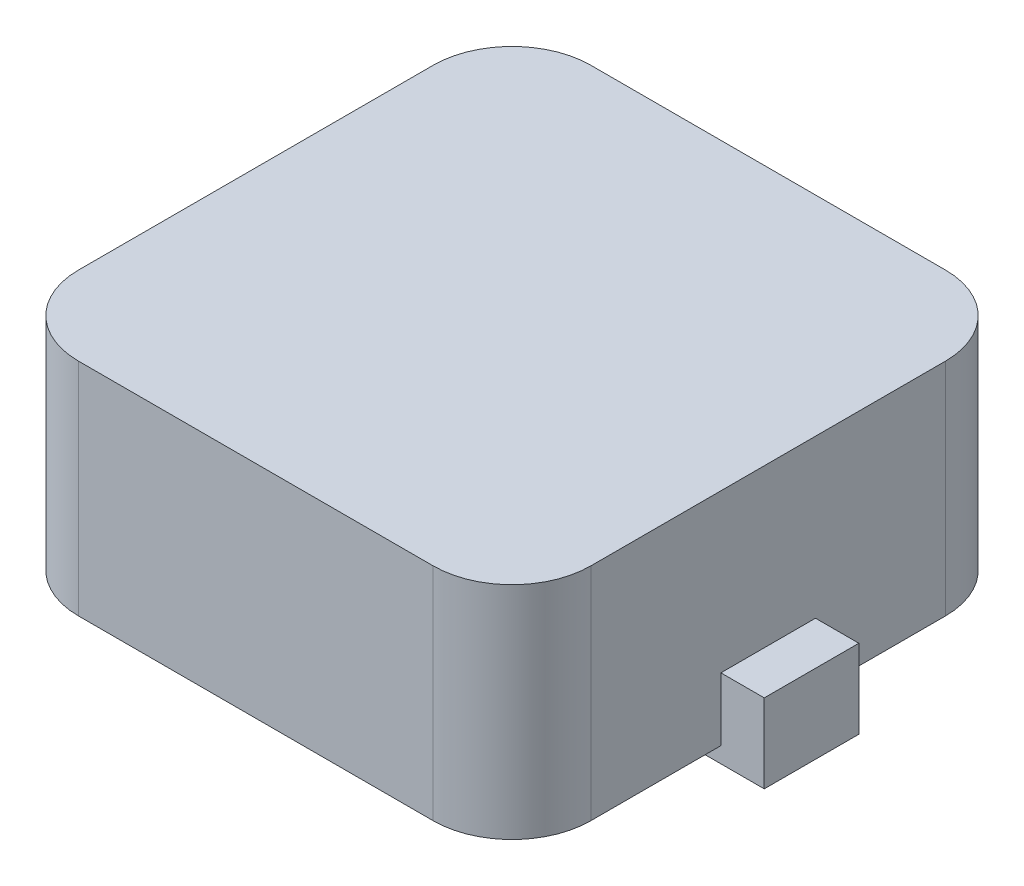
ISO-10303-21;
HEADER;
FILE_DESCRIPTION(('STEP AP214'),'2;1');
FILE_NAME('part.step','',(''),(''),'','','');
FILE_SCHEMA(('AUTOMOTIVE_DESIGN { 1 0 10303 214 1 1 1 1 }'));
ENDSEC;
DATA;
#1=APPLICATION_CONTEXT('core data for automotive mechanical design processes');
#2=APPLICATION_PROTOCOL_DEFINITION('international standard','automotive_design',2000,#1);
#3=PRODUCT_CONTEXT('',#1,'mechanical');
#4=PRODUCT('Part','Part','',(#3));
#5=PRODUCT_RELATED_PRODUCT_CATEGORY('part','',(#4));
#6=PRODUCT_DEFINITION_FORMATION('','',#4);
#7=PRODUCT_DEFINITION_CONTEXT('part definition',#1,'design');
#8=PRODUCT_DEFINITION('design','',#6,#7);
#9=PRODUCT_DEFINITION_SHAPE('','',#8);
#10=(LENGTH_UNIT() NAMED_UNIT(*) SI_UNIT(.MILLI.,.METRE.));
#11=(NAMED_UNIT(*) PLANE_ANGLE_UNIT() SI_UNIT($,.RADIAN.));
#12=(NAMED_UNIT(*) SI_UNIT($,.STERADIAN.) SOLID_ANGLE_UNIT());
#13=UNCERTAINTY_MEASURE_WITH_UNIT(LENGTH_MEASURE(1.E-05),#10,'distance_accuracy_value','');
#14=(GEOMETRIC_REPRESENTATION_CONTEXT(3) GLOBAL_UNCERTAINTY_ASSIGNED_CONTEXT((#13)) GLOBAL_UNIT_ASSIGNED_CONTEXT((#10,
#11,#12)) REPRESENTATION_CONTEXT('',''));
#15=CARTESIAN_POINT('',(0.,0.,0.));
#16=DIRECTION('',(0.,0.,1.));
#17=DIRECTION('',(1.,0.,0.));
#18=AXIS2_PLACEMENT_3D('',#15,#16,#17);
#19=CARTESIAN_POINT('',(3.25,0.,-2.25));
#20=DIRECTION('',(-1.,0.,0.));
#21=DIRECTION('',(0.,0.,1.));
#22=AXIS2_PLACEMENT_3D('',#19,#20,#21);
#23=PLANE('',#22);
#24=DIRECTION('',(0.,1.,0.));
#25=VECTOR('',#24,1.);
#26=CARTESIAN_POINT('',(3.25,1.4,2.2500000002051));
#27=LINE('',#26,#25);
#28=CARTESIAN_POINT('',(3.25,2.8,2.25000000010255));
#29=VERTEX_POINT('',#28);
#30=CARTESIAN_POINT('',(3.25,0.,2.25000000010255));
#31=VERTEX_POINT('',#30);
#32=EDGE_CURVE('E262',#29,#31,#27,.F.);
#33=ORIENTED_EDGE('',*,*,#32,.T.);
#34=DIRECTION('',(0.,0.,1.));
#35=VECTOR('',#34,1.);
#36=CARTESIAN_POINT('',(3.25,0.,0.));
#37=LINE('',#36,#35);
#38=CARTESIAN_POINT('',(3.25,0.,0.599999998333334));
#39=VERTEX_POINT('',#38);
#40=EDGE_CURVE('E273',#39,#31,#37,.T.);
#41=ORIENTED_EDGE('',*,*,#40,.F.);
#42=DIRECTION('',(0.,-1.,0.));
#43=VECTOR('',#42,1.);
#44=CARTESIAN_POINT('',(3.25,1.4,0.5999999985));
#45=LINE('',#44,#43);
#46=CARTESIAN_POINT('',(3.25,0.800000000533333,0.599999999));
#47=VERTEX_POINT('',#46);
#48=EDGE_CURVE('E276',#47,#39,#45,.T.);
#49=ORIENTED_EDGE('',*,*,#48,.F.);
#50=DIRECTION('',(0.,0.,1.));
#51=VECTOR('',#50,1.);
#52=CARTESIAN_POINT('',(3.25,0.8000000008,0.));
#53=LINE('',#52,#51);
#54=CARTESIAN_POINT('',(3.25,0.800000000533333,-0.599999999));
#55=VERTEX_POINT('',#54);
#56=EDGE_CURVE('E311',#55,#47,#53,.T.);
#57=ORIENTED_EDGE('',*,*,#56,.F.);
#58=DIRECTION('',(0.,1.,0.));
#59=VECTOR('',#58,1.);
#60=CARTESIAN_POINT('',(3.25,1.4,-0.5999999985));
#61=LINE('',#60,#59);
#62=CARTESIAN_POINT('',(3.25,0.,-0.599999998333333));
#63=VERTEX_POINT('',#62);
#64=EDGE_CURVE('E270',#63,#55,#61,.T.);
#65=ORIENTED_EDGE('',*,*,#64,.F.);
#66=DIRECTION('',(0.,0.,1.));
#67=VECTOR('',#66,1.);
#68=CARTESIAN_POINT('',(3.25,0.,0.));
#69=LINE('',#68,#67);
#70=CARTESIAN_POINT('',(3.25,0.,-2.24999999989745));
#71=VERTEX_POINT('',#70);
#72=EDGE_CURVE('E268',#71,#63,#69,.T.);
#73=ORIENTED_EDGE('',*,*,#72,.F.);
#74=DIRECTION('',(0.,-1.,0.));
#75=VECTOR('',#74,1.);
#76=CARTESIAN_POINT('',(3.25,1.4,-2.2499999997949));
#77=LINE('',#76,#75);
#78=CARTESIAN_POINT('',(3.25,2.8,-2.24999999989745));
#79=VERTEX_POINT('',#78);
#80=EDGE_CURVE('E265',#71,#79,#77,.F.);
#81=ORIENTED_EDGE('',*,*,#80,.T.);
#82=DIRECTION('',(0.,0.,1.));
#83=VECTOR('',#82,1.);
#84=CARTESIAN_POINT('',(3.25,2.8,0.));
#85=LINE('',#84,#83);
#86=EDGE_CURVE('E239',#79,#29,#85,.T.);
#87=ORIENTED_EDGE('',*,*,#86,.T.);
#88=EDGE_LOOP('',(#33,#41,#49,#57,#65,#73,#81,#87));
#89=FACE_BOUND('',#88,.T.);
#90=ADVANCED_FACE('F17',(#89),#23,.F.);
#91=CARTESIAN_POINT('',(-3.25,0.,2.25));
#92=DIRECTION('',(1.,0.,0.));
#93=DIRECTION('',(0.,0.,-1.));
#94=AXIS2_PLACEMENT_3D('',#91,#92,#93);
#95=PLANE('',#94);
#96=DIRECTION('',(0.,-1.,0.));
#97=VECTOR('',#96,1.);
#98=CARTESIAN_POINT('',(-3.25,1.4,2.25000000038469));
#99=LINE('',#98,#97);
#100=CARTESIAN_POINT('',(-3.25,0.,2.25000000019235));
#101=VERTEX_POINT('',#100);
#102=CARTESIAN_POINT('',(-3.25,2.8,2.25000000019235));
#103=VERTEX_POINT('',#102);
#104=EDGE_CURVE('E157',#101,#103,#99,.F.);
#105=ORIENTED_EDGE('',*,*,#104,.T.);
#106=DIRECTION('',(0.,0.,-1.));
#107=VECTOR('',#106,1.);
#108=CARTESIAN_POINT('',(-3.25,2.8,0.));
#109=LINE('',#108,#107);
#110=CARTESIAN_POINT('',(-3.25,2.8,-2.24999999980766));
#111=VERTEX_POINT('',#110);
#112=EDGE_CURVE('E243',#103,#111,#109,.T.);
#113=ORIENTED_EDGE('',*,*,#112,.T.);
#114=DIRECTION('',(0.,1.,0.));
#115=VECTOR('',#114,1.);
#116=CARTESIAN_POINT('',(-3.25,1.4,-2.24999999961531));
#117=LINE('',#116,#115);
#118=CARTESIAN_POINT('',(-3.25,0.,-2.24999999980766));
#119=VERTEX_POINT('',#118);
#120=EDGE_CURVE('E253',#111,#119,#117,.F.);
#121=ORIENTED_EDGE('',*,*,#120,.T.);
#122=DIRECTION('',(0.,0.,-1.));
#123=VECTOR('',#122,1.);
#124=CARTESIAN_POINT('',(-3.25,0.,0.));
#125=LINE('',#124,#123);
#126=CARTESIAN_POINT('',(-3.25,0.,-0.599999998333334));
#127=VERTEX_POINT('',#126);
#128=EDGE_CURVE('E257',#127,#119,#125,.T.);
#129=ORIENTED_EDGE('',*,*,#128,.F.);
#130=DIRECTION('',(0.,-1.,0.));
#131=VECTOR('',#130,1.);
#132=CARTESIAN_POINT('',(-3.25,1.4,-0.5999999985));
#133=LINE('',#132,#131);
#134=CARTESIAN_POINT('',(-3.25,0.8000000004,-0.5999999985));
#135=VERTEX_POINT('',#134);
#136=EDGE_CURVE('E259',#135,#127,#133,.T.);
#137=ORIENTED_EDGE('',*,*,#136,.F.);
#138=DIRECTION('',(0.,0.,-1.));
#139=VECTOR('',#138,1.);
#140=CARTESIAN_POINT('',(-3.25,0.8,0.));
#141=LINE('',#140,#139);
#142=CARTESIAN_POINT('',(-3.25,0.8000000002,0.599999998875));
#143=VERTEX_POINT('',#142);
#144=EDGE_CURVE('E249',#143,#135,#141,.T.);
#145=ORIENTED_EDGE('',*,*,#144,.F.);
#146=DIRECTION('',(0.,1.,0.));
#147=VECTOR('',#146,1.);
#148=CARTESIAN_POINT('',(-3.25,1.4,0.5999999985));
#149=LINE('',#148,#147);
#150=CARTESIAN_POINT('',(-3.25,0.,0.599999998333333));
#151=VERTEX_POINT('',#150);
#152=EDGE_CURVE('E275',#151,#143,#149,.T.);
#153=ORIENTED_EDGE('',*,*,#152,.F.);
#154=DIRECTION('',(0.,0.,-1.));
#155=VECTOR('',#154,1.);
#156=CARTESIAN_POINT('',(-3.25,0.,0.));
#157=LINE('',#156,#155);
#158=EDGE_CURVE('E161',#101,#151,#157,.T.);
#159=ORIENTED_EDGE('',*,*,#158,.F.);
#160=EDGE_LOOP('',(#105,#113,#121,#129,#137,#145,#153,#159));
#161=FACE_BOUND('',#160,.T.);
#162=ADVANCED_FACE('F363',(#161),#95,.F.);
#163=CARTESIAN_POINT('',(-2.25,2.8,2.25));
#164=DIRECTION('',(0.,-1.,0.));
#165=DIRECTION('',(0.,0.,-1.));
#166=AXIS2_PLACEMENT_3D('',#163,#164,#165);
#167=CYLINDRICAL_SURFACE('',#166,1.);
#168=ORIENTED_EDGE('',*,*,#104,.F.);
#169=CARTESIAN_POINT('',(-2.25,0.,2.25));
#170=DIRECTION('',(0.,-1.,0.));
#171=DIRECTION('',(0.,0.,-1.));
#172=AXIS2_PLACEMENT_3D('',#169,#170,#171);
#173=CIRCLE('',#172,1.);
#174=CARTESIAN_POINT('',(-2.25,0.,3.25));
#175=VERTEX_POINT('',#174);
#176=EDGE_CURVE('E21',#175,#101,#173,.T.);
#177=ORIENTED_EDGE('',*,*,#176,.F.);
#178=DIRECTION('',(0.,1.,0.));
#179=VECTOR('',#178,1.);
#180=CARTESIAN_POINT('',(-2.25,1.4,3.25));
#181=LINE('',#180,#179);
#182=CARTESIAN_POINT('',(-2.25,2.8,3.25));
#183=VERTEX_POINT('',#182);
#184=EDGE_CURVE('E155',#175,#183,#181,.T.);
#185=ORIENTED_EDGE('',*,*,#184,.T.);
#186=CARTESIAN_POINT('',(-2.25,2.8,2.25));
#187=DIRECTION('',(0.,-1.,0.));
#188=DIRECTION('',(0.,0.,-1.));
#189=AXIS2_PLACEMENT_3D('',#186,#187,#188);
#190=CIRCLE('',#189,1.);
#191=EDGE_CURVE('E245',#183,#103,#190,.T.);
#192=ORIENTED_EDGE('',*,*,#191,.T.);
#193=EDGE_LOOP('',(#168,#177,#185,#192));
#194=FACE_BOUND('',#193,.T.);
#195=ADVANCED_FACE('F153',(#194),#167,.T.);
#196=CARTESIAN_POINT('',(2.25,2.8,2.25));
#197=DIRECTION('',(0.,-1.,0.));
#198=DIRECTION('',(0.,0.,-1.));
#199=AXIS2_PLACEMENT_3D('',#196,#197,#198);
#200=CYLINDRICAL_SURFACE('',#199,1.);
#201=DIRECTION('',(0.,-1.,0.));
#202=VECTOR('',#201,1.);
#203=CARTESIAN_POINT('',(2.25,1.4,3.25));
#204=LINE('',#203,#202);
#205=CARTESIAN_POINT('',(2.25,2.8,3.25));
#206=VERTEX_POINT('',#205);
#207=CARTESIAN_POINT('',(2.25,0.,3.25));
#208=VERTEX_POINT('',#207);
#209=EDGE_CURVE('E232',#206,#208,#204,.T.);
#210=ORIENTED_EDGE('',*,*,#209,.T.);
#211=CARTESIAN_POINT('',(2.25,0.,2.25));
#212=DIRECTION('',(0.,-1.,0.));
#213=DIRECTION('',(0.,0.,-1.));
#214=AXIS2_PLACEMENT_3D('',#211,#212,#213);
#215=CIRCLE('',#214,1.);
#216=EDGE_CURVE('E174',#31,#208,#215,.T.);
#217=ORIENTED_EDGE('',*,*,#216,.F.);
#218=ORIENTED_EDGE('',*,*,#32,.F.);
#219=CARTESIAN_POINT('',(2.25,2.8,2.25));
#220=DIRECTION('',(0.,-1.,0.));
#221=DIRECTION('',(0.,0.,-1.));
#222=AXIS2_PLACEMENT_3D('',#219,#220,#221);
#223=CIRCLE('',#222,1.);
#224=EDGE_CURVE('E241',#29,#206,#223,.T.);
#225=ORIENTED_EDGE('',*,*,#224,.T.);
#226=EDGE_LOOP('',(#210,#217,#218,#225));
#227=FACE_BOUND('',#226,.T.);
#228=ADVANCED_FACE('F358',(#227),#200,.T.);
#229=CARTESIAN_POINT('',(-3.8,-0.2,0.6));
#230=DIRECTION('',(0.,-1.,0.));
#231=DIRECTION('',(0.,0.,-1.));
#232=AXIS2_PLACEMENT_3D('',#229,#230,#231);
#233=PLANE('',#232);
#234=DIRECTION('',(0.,0.,1.));
#235=VECTOR('',#234,1.);
#236=CARTESIAN_POINT('',(-2.6,-0.2,0.));
#237=LINE('',#236,#235);
#238=CARTESIAN_POINT('',(-2.6,-0.2,-0.6));
#239=VERTEX_POINT('',#238);
#240=CARTESIAN_POINT('',(-2.6,-0.2,0.6));
#241=VERTEX_POINT('',#240);
#242=EDGE_CURVE('E223',#239,#241,#237,.T.);
#243=ORIENTED_EDGE('',*,*,#242,.T.);
#244=DIRECTION('',(1.,0.,0.));
#245=VECTOR('',#244,1.);
#246=CARTESIAN_POINT('',(-3.2,-0.2,0.6));
#247=LINE('',#246,#245);
#248=CARTESIAN_POINT('',(-3.8,-0.2,0.6));
#249=VERTEX_POINT('',#248);
#250=EDGE_CURVE('E225',#249,#241,#247,.T.);
#251=ORIENTED_EDGE('',*,*,#250,.F.);
#252=DIRECTION('',(0.,0.,1.));
#253=VECTOR('',#252,1.);
#254=CARTESIAN_POINT('',(-3.8,-0.2,0.));
#255=LINE('',#254,#253);
#256=CARTESIAN_POINT('',(-3.8,-0.2,-0.6));
#257=VERTEX_POINT('',#256);
#258=EDGE_CURVE('E250',#257,#249,#255,.T.);
#259=ORIENTED_EDGE('',*,*,#258,.F.);
#260=DIRECTION('',(-1.,0.,0.));
#261=VECTOR('',#260,1.);
#262=CARTESIAN_POINT('',(-3.2,-0.2,-0.6));
#263=LINE('',#262,#261);
#264=EDGE_CURVE('E215',#239,#257,#263,.T.);
#265=ORIENTED_EDGE('',*,*,#264,.F.);
#266=EDGE_LOOP('',(#243,#251,#259,#265));
#267=FACE_BOUND('',#266,.T.);
#268=ADVANCED_FACE('F390',(#267),#233,.T.);
#269=CARTESIAN_POINT('',(-3.8,-0.2,-0.6));
#270=DIRECTION('',(-1.,0.,0.));
#271=DIRECTION('',(0.,0.,1.));
#272=AXIS2_PLACEMENT_3D('',#269,#270,#271);
#273=PLANE('',#272);
#274=DIRECTION('',(0.,-1.,0.));
#275=VECTOR('',#274,1.);
#276=CARTESIAN_POINT('',(-3.8,0.3,0.6));
#277=LINE('',#276,#275);
#278=CARTESIAN_POINT('',(-3.8,0.8,0.6));
#279=VERTEX_POINT('',#278);
#280=EDGE_CURVE('E228',#279,#249,#277,.T.);
#281=ORIENTED_EDGE('',*,*,#280,.F.);
#282=DIRECTION('',(0.,0.,1.));
#283=VECTOR('',#282,1.);
#284=CARTESIAN_POINT('',(-3.8,0.8,0.));
#285=LINE('',#284,#283);
#286=CARTESIAN_POINT('',(-3.8,0.8,-0.6));
#287=VERTEX_POINT('',#286);
#288=EDGE_CURVE('E246',#287,#279,#285,.T.);
#289=ORIENTED_EDGE('',*,*,#288,.F.);
#290=DIRECTION('',(0.,1.,0.));
#291=VECTOR('',#290,1.);
#292=CARTESIAN_POINT('',(-3.8,0.3,-0.6));
#293=LINE('',#292,#291);
#294=EDGE_CURVE('E212',#257,#287,#293,.T.);
#295=ORIENTED_EDGE('',*,*,#294,.F.);
#296=ORIENTED_EDGE('',*,*,#258,.T.);
#297=EDGE_LOOP('',(#281,#289,#295,#296));
#298=FACE_BOUND('',#297,.T.);
#299=ADVANCED_FACE('F388',(#298),#273,.T.);
#300=CARTESIAN_POINT('',(-3.8,0.8,-0.6));
#301=DIRECTION('',(0.,1.,0.));
#302=DIRECTION('',(0.,0.,1.));
#303=AXIS2_PLACEMENT_3D('',#300,#301,#302);
#304=PLANE('',#303);
#305=ORIENTED_EDGE('',*,*,#288,.T.);
#306=DIRECTION('',(-1.,0.,0.));
#307=VECTOR('',#306,1.);
#308=CARTESIAN_POINT('',(-3.2,0.8,0.6));
#309=LINE('',#308,#307);
#310=EDGE_CURVE('E231',#143,#279,#309,.T.);
#311=ORIENTED_EDGE('',*,*,#310,.F.);
#312=ORIENTED_EDGE('',*,*,#144,.T.);
#313=DIRECTION('',(1.,0.,0.));
#314=VECTOR('',#313,1.);
#315=CARTESIAN_POINT('',(-3.2,0.8,-0.6));
#316=LINE('',#315,#314);
#317=EDGE_CURVE('E211',#287,#135,#316,.T.);
#318=ORIENTED_EDGE('',*,*,#317,.F.);
#319=EDGE_LOOP('',(#305,#311,#312,#318));
#320=FACE_BOUND('',#319,.T.);
#321=ADVANCED_FACE('F382',(#320),#304,.T.);
#322=CARTESIAN_POINT('',(2.25,2.8,-2.25));
#323=DIRECTION('',(0.,-1.,0.));
#324=DIRECTION('',(0.,0.,-1.));
#325=AXIS2_PLACEMENT_3D('',#322,#323,#324);
#326=CYLINDRICAL_SURFACE('',#325,1.);
#327=ORIENTED_EDGE('',*,*,#80,.F.);
#328=CARTESIAN_POINT('',(2.25,0.,-2.25));
#329=DIRECTION('',(0.,-1.,0.));
#330=DIRECTION('',(0.,0.,-1.));
#331=AXIS2_PLACEMENT_3D('',#328,#329,#330);
#332=CIRCLE('',#331,1.);
#333=CARTESIAN_POINT('',(2.25,0.,-3.25));
#334=VERTEX_POINT('',#333);
#335=EDGE_CURVE('E248',#334,#71,#332,.T.);
#336=ORIENTED_EDGE('',*,*,#335,.F.);
#337=DIRECTION('',(0.,1.,0.));
#338=VECTOR('',#337,1.);
#339=CARTESIAN_POINT('',(2.25,1.4,-3.25));
#340=LINE('',#339,#338);
#341=CARTESIAN_POINT('',(2.25,2.8,-3.25));
#342=VERTEX_POINT('',#341);
#343=EDGE_CURVE('E209',#334,#342,#340,.T.);
#344=ORIENTED_EDGE('',*,*,#343,.T.);
#345=CARTESIAN_POINT('',(2.25,2.8,-2.25));
#346=DIRECTION('',(0.,-1.,0.));
#347=DIRECTION('',(0.,0.,-1.));
#348=AXIS2_PLACEMENT_3D('',#345,#346,#347);
#349=CIRCLE('',#348,1.);
#350=EDGE_CURVE('E242',#342,#79,#349,.T.);
#351=ORIENTED_EDGE('',*,*,#350,.T.);
#352=EDGE_LOOP('',(#327,#336,#344,#351));
#353=FACE_BOUND('',#352,.T.);
#354=ADVANCED_FACE('F348',(#353),#326,.T.);
#355=CARTESIAN_POINT('',(-3.25,2.8,3.25));
#356=DIRECTION('',(0.,-1.,0.));
#357=DIRECTION('',(0.,0.,-1.));
#358=AXIS2_PLACEMENT_3D('',#355,#356,#357);
#359=PLANE('',#358);
#360=ORIENTED_EDGE('',*,*,#224,.F.);
#361=ORIENTED_EDGE('',*,*,#86,.F.);
#362=ORIENTED_EDGE('',*,*,#350,.F.);
#363=DIRECTION('',(-1.,0.,0.));
#364=VECTOR('',#363,1.);
#365=CARTESIAN_POINT('',(0.,2.8,-3.25));
#366=LINE('',#365,#364);
#367=CARTESIAN_POINT('',(-2.25,2.8,-3.25));
#368=VERTEX_POINT('',#367);
#369=EDGE_CURVE('E208',#342,#368,#366,.T.);
#370=ORIENTED_EDGE('',*,*,#369,.T.);
#371=CARTESIAN_POINT('',(-2.25,2.8,-2.25));
#372=DIRECTION('',(0.,-1.,0.));
#373=DIRECTION('',(0.,0.,-1.));
#374=AXIS2_PLACEMENT_3D('',#371,#372,#373);
#375=CIRCLE('',#374,1.);
#376=EDGE_CURVE('E237',#368,#111,#375,.F.);
#377=ORIENTED_EDGE('',*,*,#376,.T.);
#378=ORIENTED_EDGE('',*,*,#112,.F.);
#379=ORIENTED_EDGE('',*,*,#191,.F.);
#380=DIRECTION('',(1.,0.,0.));
#381=VECTOR('',#380,1.);
#382=CARTESIAN_POINT('',(0.,2.8,3.25));
#383=LINE('',#382,#381);
#384=EDGE_CURVE('E169',#183,#206,#383,.T.);
#385=ORIENTED_EDGE('',*,*,#384,.T.);
#386=EDGE_LOOP('',(#360,#361,#362,#370,#377,#378,#379,#385));
#387=FACE_BOUND('',#386,.T.);
#388=ADVANCED_FACE('F354',(#387),#359,.F.);
#389=CARTESIAN_POINT('',(-2.25,2.8,-2.25));
#390=DIRECTION('',(0.,-1.,0.));
#391=DIRECTION('',(0.,0.,-1.));
#392=AXIS2_PLACEMENT_3D('',#389,#390,#391);
#393=CYLINDRICAL_SURFACE('',#392,1.);
#394=DIRECTION('',(0.,-1.,0.));
#395=VECTOR('',#394,1.);
#396=CARTESIAN_POINT('',(-2.25,1.4,-3.25));
#397=LINE('',#396,#395);
#398=CARTESIAN_POINT('',(-2.25,0.,-3.25));
#399=VERTEX_POINT('',#398);
#400=EDGE_CURVE('E205',#368,#399,#397,.T.);
#401=ORIENTED_EDGE('',*,*,#400,.T.);
#402=CARTESIAN_POINT('',(-2.25,0.,-2.25));
#403=DIRECTION('',(0.,-1.,0.));
#404=DIRECTION('',(0.,0.,-1.));
#405=AXIS2_PLACEMENT_3D('',#402,#403,#404);
#406=CIRCLE('',#405,1.);
#407=EDGE_CURVE('E256',#119,#399,#406,.T.);
#408=ORIENTED_EDGE('',*,*,#407,.F.);
#409=ORIENTED_EDGE('',*,*,#120,.F.);
#410=ORIENTED_EDGE('',*,*,#376,.F.);
#411=EDGE_LOOP('',(#401,#408,#409,#410));
#412=FACE_BOUND('',#411,.T.);
#413=ADVANCED_FACE('F440',(#412),#393,.T.);
#414=CARTESIAN_POINT('',(2.6,-0.2,-0.6));
#415=DIRECTION('',(0.,1.,0.));
#416=DIRECTION('',(0.,0.,1.));
#417=AXIS2_PLACEMENT_3D('',#414,#415,#416);
#418=PLANE('',#417);
#419=DIRECTION('',(1.,0.,0.));
#420=VECTOR('',#419,1.);
#421=CARTESIAN_POINT('',(3.2,-0.2,0.6));
#422=LINE('',#421,#420);
#423=CARTESIAN_POINT('',(2.6,-0.2,0.6));
#424=VERTEX_POINT('',#423);
#425=CARTESIAN_POINT('',(3.8,-0.2,0.6));
#426=VERTEX_POINT('',#425);
#427=EDGE_CURVE('E190',#424,#426,#422,.T.);
#428=ORIENTED_EDGE('',*,*,#427,.F.);
#429=DIRECTION('',(0.,0.,-1.));
#430=VECTOR('',#429,1.);
#431=CARTESIAN_POINT('',(2.6,-0.2,0.));
#432=LINE('',#431,#430);
#433=CARTESIAN_POINT('',(2.6,-0.2,-0.6));
#434=VERTEX_POINT('',#433);
#435=EDGE_CURVE('E196',#424,#434,#432,.T.);
#436=ORIENTED_EDGE('',*,*,#435,.T.);
#437=DIRECTION('',(-1.,0.,0.));
#438=VECTOR('',#437,1.);
#439=CARTESIAN_POINT('',(3.2,-0.2,-0.6));
#440=LINE('',#439,#438);
#441=CARTESIAN_POINT('',(3.8,-0.2,-0.6));
#442=VERTEX_POINT('',#441);
#443=EDGE_CURVE('E198',#442,#434,#440,.T.);
#444=ORIENTED_EDGE('',*,*,#443,.F.);
#445=DIRECTION('',(0.,0.,-1.));
#446=VECTOR('',#445,1.);
#447=CARTESIAN_POINT('',(3.8,-0.2,0.));
#448=LINE('',#447,#446);
#449=EDGE_CURVE('E235',#426,#442,#448,.T.);
#450=ORIENTED_EDGE('',*,*,#449,.F.);
#451=EDGE_LOOP('',(#428,#436,#444,#450));
#452=FACE_BOUND('',#451,.T.);
#453=ADVANCED_FACE('F436',(#452),#418,.F.);
#454=CARTESIAN_POINT('',(3.8,-0.2,0.6));
#455=DIRECTION('',(1.,0.,0.));
#456=DIRECTION('',(0.,0.,-1.));
#457=AXIS2_PLACEMENT_3D('',#454,#455,#456);
#458=PLANE('',#457);
#459=DIRECTION('',(0.,-1.,0.));
#460=VECTOR('',#459,1.);
#461=CARTESIAN_POINT('',(3.8,0.3,-0.6));
#462=LINE('',#461,#460);
#463=CARTESIAN_POINT('',(3.8,0.8,-0.6));
#464=VERTEX_POINT('',#463);
#465=EDGE_CURVE('E201',#464,#442,#462,.T.);
#466=ORIENTED_EDGE('',*,*,#465,.F.);
#467=DIRECTION('',(0.,0.,-1.));
#468=VECTOR('',#467,1.);
#469=CARTESIAN_POINT('',(3.8,0.8,0.));
#470=LINE('',#469,#468);
#471=CARTESIAN_POINT('',(3.8,0.8,0.6));
#472=VERTEX_POINT('',#471);
#473=EDGE_CURVE('E170',#472,#464,#470,.T.);
#474=ORIENTED_EDGE('',*,*,#473,.F.);
#475=DIRECTION('',(0.,1.,0.));
#476=VECTOR('',#475,1.);
#477=CARTESIAN_POINT('',(3.8,0.3,0.6));
#478=LINE('',#477,#476);
#479=EDGE_CURVE('E183',#426,#472,#478,.T.);
#480=ORIENTED_EDGE('',*,*,#479,.F.);
#481=ORIENTED_EDGE('',*,*,#449,.T.);
#482=EDGE_LOOP('',(#466,#474,#480,#481));
#483=FACE_BOUND('',#482,.T.);
#484=ADVANCED_FACE('F432',(#483),#458,.T.);
#485=CARTESIAN_POINT('',(3.25,0.8,-0.6));
#486=DIRECTION('',(0.,1.,0.));
#487=DIRECTION('',(0.,0.,1.));
#488=AXIS2_PLACEMENT_3D('',#485,#486,#487);
#489=PLANE('',#488);
#490=ORIENTED_EDGE('',*,*,#473,.T.);
#491=DIRECTION('',(1.,0.,0.));
#492=VECTOR('',#491,1.);
#493=CARTESIAN_POINT('',(3.2,0.8,-0.6));
#494=LINE('',#493,#492);
#495=EDGE_CURVE('E204',#55,#464,#494,.T.);
#496=ORIENTED_EDGE('',*,*,#495,.F.);
#497=ORIENTED_EDGE('',*,*,#56,.T.);
#498=DIRECTION('',(-1.,0.,0.));
#499=VECTOR('',#498,1.);
#500=CARTESIAN_POINT('',(3.2,0.8,0.6));
#501=LINE('',#500,#499);
#502=EDGE_CURVE('E177',#472,#47,#501,.T.);
#503=ORIENTED_EDGE('',*,*,#502,.F.);
#504=EDGE_LOOP('',(#490,#496,#497,#503));
#505=FACE_BOUND('',#504,.T.);
#506=ADVANCED_FACE('F429',(#505),#489,.T.);
#507=CARTESIAN_POINT('',(2.25,0.,3.25));
#508=DIRECTION('',(0.,0.,-1.));
#509=DIRECTION('',(-1.,0.,0.));
#510=AXIS2_PLACEMENT_3D('',#507,#508,#509);
#511=PLANE('',#510);
#512=ORIENTED_EDGE('',*,*,#209,.F.);
#513=ORIENTED_EDGE('',*,*,#384,.F.);
#514=ORIENTED_EDGE('',*,*,#184,.F.);
#515=DIRECTION('',(-1.,0.,0.));
#516=VECTOR('',#515,1.);
#517=CARTESIAN_POINT('',(0.,0.,3.25));
#518=LINE('',#517,#516);
#519=EDGE_CURVE('E167',#208,#175,#518,.T.);
#520=ORIENTED_EDGE('',*,*,#519,.F.);
#521=EDGE_LOOP('',(#512,#513,#514,#520));
#522=FACE_BOUND('',#521,.T.);
#523=ADVANCED_FACE('F166',(#522),#511,.F.);
#524=CARTESIAN_POINT('',(-3.8,-0.2,0.6));
#525=DIRECTION('',(0.,0.,1.));
#526=DIRECTION('',(1.,0.,0.));
#527=AXIS2_PLACEMENT_3D('',#524,#525,#526);
#528=PLANE('',#527);
#529=DIRECTION('',(0.,1.,0.));
#530=VECTOR('',#529,1.);
#531=CARTESIAN_POINT('',(-2.6,-0.1,0.6));
#532=LINE('',#531,#530);
#533=CARTESIAN_POINT('',(-2.6,0.,0.5999999995));
#534=VERTEX_POINT('',#533);
#535=EDGE_CURVE('E221',#241,#534,#532,.T.);
#536=ORIENTED_EDGE('',*,*,#535,.T.);
#537=DIRECTION('',(1.,0.,0.));
#538=VECTOR('',#537,1.);
#539=CARTESIAN_POINT('',(0.,0.,0.599999998));
#540=LINE('',#539,#538);
#541=EDGE_CURVE('E176',#151,#534,#540,.T.);
#542=ORIENTED_EDGE('',*,*,#541,.F.);
#543=ORIENTED_EDGE('',*,*,#152,.T.);
#544=ORIENTED_EDGE('',*,*,#310,.T.);
#545=ORIENTED_EDGE('',*,*,#280,.T.);
#546=ORIENTED_EDGE('',*,*,#250,.T.);
#547=EDGE_LOOP('',(#536,#542,#543,#544,#545,#546));
#548=FACE_BOUND('',#547,.T.);
#549=ADVANCED_FACE('F371',(#548),#528,.T.);
#550=CARTESIAN_POINT('',(-2.6,-0.2,-0.6));
#551=DIRECTION('',(-1.,0.,0.));
#552=DIRECTION('',(0.,0.,1.));
#553=AXIS2_PLACEMENT_3D('',#550,#551,#552);
#554=PLANE('',#553);
#555=ORIENTED_EDGE('',*,*,#535,.F.);
#556=ORIENTED_EDGE('',*,*,#242,.F.);
#557=DIRECTION('',(0.,-1.,0.));
#558=VECTOR('',#557,1.);
#559=CARTESIAN_POINT('',(-2.6,0.3,-0.6));
#560=LINE('',#559,#558);
#561=CARTESIAN_POINT('',(-2.6,0.,-0.5999999995));
#562=VERTEX_POINT('',#561);
#563=EDGE_CURVE('E218',#562,#239,#560,.T.);
#564=ORIENTED_EDGE('',*,*,#563,.F.);
#565=DIRECTION('',(0.,0.,-1.));
#566=VECTOR('',#565,1.);
#567=CARTESIAN_POINT('',(-2.6,0.,0.));
#568=LINE('',#567,#566);
#569=EDGE_CURVE('E180',#534,#562,#568,.T.);
#570=ORIENTED_EDGE('',*,*,#569,.F.);
#571=EDGE_LOOP('',(#555,#556,#564,#570));
#572=FACE_BOUND('',#571,.T.);
#573=ADVANCED_FACE('F376',(#572),#554,.F.);
#574=CARTESIAN_POINT('',(-2.6,-0.2,-0.6));
#575=DIRECTION('',(0.,0.,-1.));
#576=DIRECTION('',(-1.,0.,0.));
#577=AXIS2_PLACEMENT_3D('',#574,#575,#576);
#578=PLANE('',#577);
#579=ORIENTED_EDGE('',*,*,#294,.T.);
#580=ORIENTED_EDGE('',*,*,#317,.T.);
#581=ORIENTED_EDGE('',*,*,#136,.T.);
#582=DIRECTION('',(-1.,0.,0.));
#583=VECTOR('',#582,1.);
#584=CARTESIAN_POINT('',(0.,0.,-0.599999998000001));
#585=LINE('',#584,#583);
#586=EDGE_CURVE('E287',#562,#127,#585,.T.);
#587=ORIENTED_EDGE('',*,*,#586,.F.);
#588=ORIENTED_EDGE('',*,*,#563,.T.);
#589=ORIENTED_EDGE('',*,*,#264,.T.);
#590=EDGE_LOOP('',(#579,#580,#581,#587,#588,#589));
#591=FACE_BOUND('',#590,.T.);
#592=ADVANCED_FACE('F383',(#591),#578,.T.);
#593=CARTESIAN_POINT('',(-2.25,0.,-3.25));
#594=DIRECTION('',(0.,0.,1.));
#595=DIRECTION('',(1.,0.,0.));
#596=AXIS2_PLACEMENT_3D('',#593,#594,#595);
#597=PLANE('',#596);
#598=ORIENTED_EDGE('',*,*,#400,.F.);
#599=ORIENTED_EDGE('',*,*,#369,.F.);
#600=ORIENTED_EDGE('',*,*,#343,.F.);
#601=DIRECTION('',(1.,0.,0.));
#602=VECTOR('',#601,1.);
#603=CARTESIAN_POINT('',(0.,0.,-3.25));
#604=LINE('',#603,#602);
#605=EDGE_CURVE('E290',#399,#334,#604,.T.);
#606=ORIENTED_EDGE('',*,*,#605,.F.);
#607=EDGE_LOOP('',(#598,#599,#600,#606));
#608=FACE_BOUND('',#607,.T.);
#609=ADVANCED_FACE('F416',(#608),#597,.F.);
#610=CARTESIAN_POINT('',(3.8,-0.2,-0.6));
#611=DIRECTION('',(0.,0.,-1.));
#612=DIRECTION('',(-1.,0.,0.));
#613=AXIS2_PLACEMENT_3D('',#610,#611,#612);
#614=PLANE('',#613);
#615=DIRECTION('',(0.,1.,0.));
#616=VECTOR('',#615,1.);
#617=CARTESIAN_POINT('',(2.6,-0.1,-0.6));
#618=LINE('',#617,#616);
#619=CARTESIAN_POINT('',(2.6,0.,-0.5999999995));
#620=VERTEX_POINT('',#619);
#621=EDGE_CURVE('E194',#434,#620,#618,.T.);
#622=ORIENTED_EDGE('',*,*,#621,.T.);
#623=DIRECTION('',(-1.,0.,0.));
#624=VECTOR('',#623,1.);
#625=CARTESIAN_POINT('',(0.,0.,-0.599999998000001));
#626=LINE('',#625,#624);
#627=EDGE_CURVE('E326',#63,#620,#626,.T.);
#628=ORIENTED_EDGE('',*,*,#627,.F.);
#629=ORIENTED_EDGE('',*,*,#64,.T.);
#630=ORIENTED_EDGE('',*,*,#495,.T.);
#631=ORIENTED_EDGE('',*,*,#465,.T.);
#632=ORIENTED_EDGE('',*,*,#443,.T.);
#633=EDGE_LOOP('',(#622,#628,#629,#630,#631,#632));
#634=FACE_BOUND('',#633,.T.);
#635=ADVANCED_FACE('F411',(#634),#614,.T.);
#636=CARTESIAN_POINT('',(2.6,-0.2,0.6));
#637=DIRECTION('',(1.,0.,0.));
#638=DIRECTION('',(0.,0.,-1.));
#639=AXIS2_PLACEMENT_3D('',#636,#637,#638);
#640=PLANE('',#639);
#641=ORIENTED_EDGE('',*,*,#621,.F.);
#642=ORIENTED_EDGE('',*,*,#435,.F.);
#643=DIRECTION('',(0.,-1.,0.));
#644=VECTOR('',#643,1.);
#645=CARTESIAN_POINT('',(2.6,0.3,0.6));
#646=LINE('',#645,#644);
#647=CARTESIAN_POINT('',(2.6,0.,0.5999999995));
#648=VERTEX_POINT('',#647);
#649=EDGE_CURVE('E36',#648,#424,#646,.T.);
#650=ORIENTED_EDGE('',*,*,#649,.F.);
#651=DIRECTION('',(0.,0.,1.));
#652=VECTOR('',#651,1.);
#653=CARTESIAN_POINT('',(2.6,0.,0.));
#654=LINE('',#653,#652);
#655=EDGE_CURVE('E27',#620,#648,#654,.T.);
#656=ORIENTED_EDGE('',*,*,#655,.F.);
#657=EDGE_LOOP('',(#641,#642,#650,#656));
#658=FACE_BOUND('',#657,.T.);
#659=ADVANCED_FACE('F406',(#658),#640,.F.);
#660=CARTESIAN_POINT('',(2.6,-0.2,0.6));
#661=DIRECTION('',(0.,0.,1.));
#662=DIRECTION('',(1.,0.,0.));
#663=AXIS2_PLACEMENT_3D('',#660,#661,#662);
#664=PLANE('',#663);
#665=ORIENTED_EDGE('',*,*,#479,.T.);
#666=ORIENTED_EDGE('',*,*,#502,.T.);
#667=ORIENTED_EDGE('',*,*,#48,.T.);
#668=DIRECTION('',(1.,0.,0.));
#669=VECTOR('',#668,1.);
#670=CARTESIAN_POINT('',(0.,0.,0.599999998));
#671=LINE('',#670,#669);
#672=EDGE_CURVE('E11',#648,#39,#671,.T.);
#673=ORIENTED_EDGE('',*,*,#672,.F.);
#674=ORIENTED_EDGE('',*,*,#649,.T.);
#675=ORIENTED_EDGE('',*,*,#427,.T.);
#676=EDGE_LOOP('',(#665,#666,#667,#673,#674,#675));
#677=FACE_BOUND('',#676,.T.);
#678=ADVANCED_FACE('F402',(#677),#664,.T.);
#679=CARTESIAN_POINT('',(-3.25,0.,3.25));
#680=DIRECTION('',(0.,-1.,0.));
#681=DIRECTION('',(0.,0.,-1.));
#682=AXIS2_PLACEMENT_3D('',#679,#680,#681);
#683=PLANE('',#682);
#684=ORIENTED_EDGE('',*,*,#655,.T.);
#685=ORIENTED_EDGE('',*,*,#672,.T.);
#686=ORIENTED_EDGE('',*,*,#40,.T.);
#687=ORIENTED_EDGE('',*,*,#216,.T.);
#688=ORIENTED_EDGE('',*,*,#519,.T.);
#689=ORIENTED_EDGE('',*,*,#176,.T.);
#690=ORIENTED_EDGE('',*,*,#158,.T.);
#691=ORIENTED_EDGE('',*,*,#541,.T.);
#692=ORIENTED_EDGE('',*,*,#569,.T.);
#693=ORIENTED_EDGE('',*,*,#586,.T.);
#694=ORIENTED_EDGE('',*,*,#128,.T.);
#695=ORIENTED_EDGE('',*,*,#407,.T.);
#696=ORIENTED_EDGE('',*,*,#605,.T.);
#697=ORIENTED_EDGE('',*,*,#335,.T.);
#698=ORIENTED_EDGE('',*,*,#72,.T.);
#699=ORIENTED_EDGE('',*,*,#627,.T.);
#700=EDGE_LOOP('',(#684,#685,#686,#687,#688,#689,#690,#691,#692,#693,#694,#695,#696,#697,#698,#699));
#701=FACE_BOUND('',#700,.T.);
#702=ADVANCED_FACE('F19',(#701),#683,.T.);
#703=CLOSED_SHELL('',(#90,#162,#195,#228,#268,#299,#321,#354,#388,#413,#453,#484,#506,#523,#549,
#573,#592,#609,#635,#659,#678,#702));
#704=MANIFOLD_SOLID_BREP('B1',#703);
#705=ADVANCED_BREP_SHAPE_REPRESENTATION('',(#18,#704),#14);
#706=SHAPE_DEFINITION_REPRESENTATION(#9,#705);
ENDSEC;
END-ISO-10303-21;
